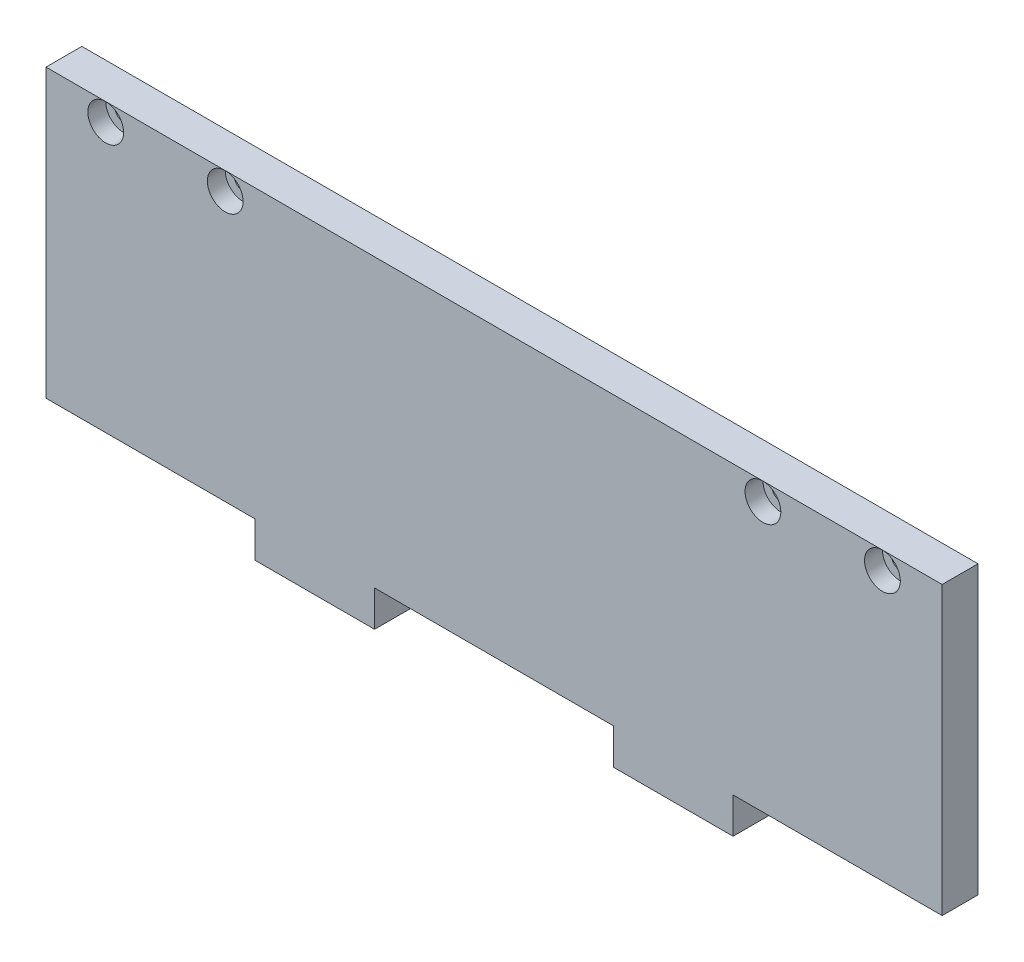
ISO-10303-21;
HEADER;
FILE_DESCRIPTION(('STEP AP214'),'2;1');
FILE_NAME('part.step','',(''),(''),'','','');
FILE_SCHEMA(('AUTOMOTIVE_DESIGN { 1 0 10303 214 1 1 1 1 }'));
ENDSEC;
DATA;
#1=APPLICATION_CONTEXT('core data for automotive mechanical design processes');
#2=APPLICATION_PROTOCOL_DEFINITION('international standard','automotive_design',2000,#1);
#3=PRODUCT_CONTEXT('',#1,'mechanical');
#4=PRODUCT('Part','Part','',(#3));
#5=PRODUCT_RELATED_PRODUCT_CATEGORY('part','',(#4));
#6=PRODUCT_DEFINITION_FORMATION('','',#4);
#7=PRODUCT_DEFINITION_CONTEXT('part definition',#1,'design');
#8=PRODUCT_DEFINITION('design','',#6,#7);
#9=PRODUCT_DEFINITION_SHAPE('','',#8);
#10=(LENGTH_UNIT() NAMED_UNIT(*) SI_UNIT(.MILLI.,.METRE.));
#11=(NAMED_UNIT(*) PLANE_ANGLE_UNIT() SI_UNIT($,.RADIAN.));
#12=(NAMED_UNIT(*) SI_UNIT($,.STERADIAN.) SOLID_ANGLE_UNIT());
#13=UNCERTAINTY_MEASURE_WITH_UNIT(LENGTH_MEASURE(1.E-05),#10,'distance_accuracy_value','');
#14=(GEOMETRIC_REPRESENTATION_CONTEXT(3) GLOBAL_UNCERTAINTY_ASSIGNED_CONTEXT((#13)) GLOBAL_UNIT_ASSIGNED_CONTEXT((#10,
#11,#12)) REPRESENTATION_CONTEXT('',''));
#15=CARTESIAN_POINT('',(0.,0.,0.));
#16=DIRECTION('',(0.,0.,1.));
#17=DIRECTION('',(1.,0.,0.));
#18=AXIS2_PLACEMENT_3D('',#15,#16,#17);
#19=CARTESIAN_POINT('',(-120.,51.0000000000001,0.));
#20=DIRECTION('',(0.,0.,1.));
#21=DIRECTION('',(1.,0.,0.));
#22=AXIS2_PLACEMENT_3D('',#19,#20,#21);
#23=CYLINDRICAL_SURFACE('',#22,1.5);
#24=CARTESIAN_POINT('',(-120.,51.0000000000001,0.));
#25=DIRECTION('',(0.,0.,1.));
#26=DIRECTION('',(1.,0.,0.));
#27=AXIS2_PLACEMENT_3D('',#24,#25,#26);
#28=CIRCLE('',#27,1.5);
#29=CARTESIAN_POINT('',(-118.5,51.0000000000001,0.));
#30=VERTEX_POINT('',#29);
#31=EDGE_CURVE('E196',#30,#30,#28,.T.);
#32=ORIENTED_EDGE('',*,*,#31,.F.);
#33=EDGE_LOOP('',(#32));
#34=FACE_BOUND('',#33,.T.);
#35=CARTESIAN_POINT('',(-120.,51.0000000000001,3.));
#36=DIRECTION('',(0.,0.,1.));
#37=DIRECTION('',(1.,0.,0.));
#38=AXIS2_PLACEMENT_3D('',#35,#36,#37);
#39=CIRCLE('',#38,1.5);
#40=CARTESIAN_POINT('',(-118.5,51.0000000000001,3.));
#41=VERTEX_POINT('',#40);
#42=EDGE_CURVE('E162',#41,#41,#39,.F.);
#43=ORIENTED_EDGE('',*,*,#42,.F.);
#44=EDGE_LOOP('',(#43));
#45=FACE_BOUND('',#44,.T.);
#46=ADVANCED_FACE('F33',(#34,#45),#23,.F.);
#47=CARTESIAN_POINT('',(-140.,51.0000000000001,0.));
#48=DIRECTION('',(0.,0.,1.));
#49=DIRECTION('',(1.,0.,0.));
#50=AXIS2_PLACEMENT_3D('',#47,#48,#49);
#51=CYLINDRICAL_SURFACE('',#50,1.5);
#52=CARTESIAN_POINT('',(-140.,51.0000000000001,0.));
#53=DIRECTION('',(0.,0.,1.));
#54=DIRECTION('',(1.,0.,0.));
#55=AXIS2_PLACEMENT_3D('',#52,#53,#54);
#56=CIRCLE('',#55,1.5);
#57=CARTESIAN_POINT('',(-138.5,51.0000000000001,0.));
#58=VERTEX_POINT('',#57);
#59=EDGE_CURVE('E199',#58,#58,#56,.T.);
#60=ORIENTED_EDGE('',*,*,#59,.F.);
#61=EDGE_LOOP('',(#60));
#62=FACE_BOUND('',#61,.T.);
#63=CARTESIAN_POINT('',(-140.,51.0000000000001,3.));
#64=DIRECTION('',(0.,0.,1.));
#65=DIRECTION('',(1.,0.,0.));
#66=AXIS2_PLACEMENT_3D('',#63,#64,#65);
#67=CIRCLE('',#66,1.5);
#68=CARTESIAN_POINT('',(-138.5,51.0000000000001,3.));
#69=VERTEX_POINT('',#68);
#70=EDGE_CURVE('E157',#69,#69,#67,.F.);
#71=ORIENTED_EDGE('',*,*,#70,.F.);
#72=EDGE_LOOP('',(#71));
#73=FACE_BOUND('',#72,.T.);
#74=ADVANCED_FACE('F309',(#62,#73),#51,.F.);
#75=CARTESIAN_POINT('',(0.,0.,6.));
#76=DIRECTION('',(0.,1.,0.));
#77=DIRECTION('',(-1.,0.,0.));
#78=AXIS2_PLACEMENT_3D('',#75,#76,#77);
#79=PLANE('',#78);
#80=DIRECTION('',(1.,0.,0.));
#81=VECTOR('',#80,1.);
#82=CARTESIAN_POINT('',(0.,0.,6.));
#83=LINE('',#82,#81);
#84=CARTESIAN_POINT('',(-115.,0.,6.));
#85=VERTEX_POINT('',#84);
#86=CARTESIAN_POINT('',(-95.,0.,6.));
#87=VERTEX_POINT('',#86);
#88=EDGE_CURVE('E140',#85,#87,#83,.T.);
#89=ORIENTED_EDGE('',*,*,#88,.F.);
#90=DIRECTION('',(0.,0.,1.));
#91=VECTOR('',#90,1.);
#92=CARTESIAN_POINT('',(-115.,0.,0.));
#93=LINE('',#92,#91);
#94=CARTESIAN_POINT('',(-115.,0.,0.));
#95=VERTEX_POINT('',#94);
#96=EDGE_CURVE('E127',#95,#85,#93,.T.);
#97=ORIENTED_EDGE('',*,*,#96,.F.);
#98=DIRECTION('',(1.,0.,0.));
#99=VECTOR('',#98,1.);
#100=CARTESIAN_POINT('',(0.,0.,0.));
#101=LINE('',#100,#99);
#102=CARTESIAN_POINT('',(-95.,0.,0.));
#103=VERTEX_POINT('',#102);
#104=EDGE_CURVE('E138',#95,#103,#101,.T.);
#105=ORIENTED_EDGE('',*,*,#104,.T.);
#106=DIRECTION('',(0.,0.,1.));
#107=VECTOR('',#106,1.);
#108=CARTESIAN_POINT('',(-95.,0.,0.));
#109=LINE('',#108,#107);
#110=EDGE_CURVE('E217',#103,#87,#109,.T.);
#111=ORIENTED_EDGE('',*,*,#110,.T.);
#112=EDGE_LOOP('',(#89,#97,#105,#111));
#113=FACE_BOUND('',#112,.T.);
#114=ADVANCED_FACE('F136',(#113),#79,.F.);
#115=CARTESIAN_POINT('',(0.,0.,6.));
#116=DIRECTION('',(-1.,0.,0.));
#117=DIRECTION('',(0.,-1.,0.));
#118=AXIS2_PLACEMENT_3D('',#115,#116,#117);
#119=PLANE('',#118);
#120=DIRECTION('',(0.,1.,0.));
#121=VECTOR('',#120,1.);
#122=CARTESIAN_POINT('',(0.,0.,6.));
#123=LINE('',#122,#121);
#124=CARTESIAN_POINT('',(0.,6.,6.));
#125=VERTEX_POINT('',#124);
#126=CARTESIAN_POINT('',(0.,54.0000000000001,6.));
#127=VERTEX_POINT('',#126);
#128=EDGE_CURVE('E146',#125,#127,#123,.T.);
#129=ORIENTED_EDGE('',*,*,#128,.F.);
#130=DIRECTION('',(0.,0.,1.));
#131=VECTOR('',#130,1.);
#132=CARTESIAN_POINT('',(0.,6.,0.));
#133=LINE('',#132,#131);
#134=CARTESIAN_POINT('',(0.,6.,0.));
#135=VERTEX_POINT('',#134);
#136=EDGE_CURVE('E240',#135,#125,#133,.T.);
#137=ORIENTED_EDGE('',*,*,#136,.F.);
#138=DIRECTION('',(0.,1.,0.));
#139=VECTOR('',#138,1.);
#140=CARTESIAN_POINT('',(0.,0.,0.));
#141=LINE('',#140,#139);
#142=CARTESIAN_POINT('',(0.,54.0000000000001,0.));
#143=VERTEX_POINT('',#142);
#144=EDGE_CURVE('E248',#135,#143,#141,.T.);
#145=ORIENTED_EDGE('',*,*,#144,.T.);
#146=DIRECTION('',(0.,0.,-1.));
#147=VECTOR('',#146,1.);
#148=CARTESIAN_POINT('',(0.,54.0000000000001,6.));
#149=LINE('',#148,#147);
#150=EDGE_CURVE('E11',#127,#143,#149,.T.);
#151=ORIENTED_EDGE('',*,*,#150,.F.);
#152=EDGE_LOOP('',(#129,#137,#145,#151));
#153=FACE_BOUND('',#152,.T.);
#154=ADVANCED_FACE('F35',(#153),#119,.F.);
#155=CARTESIAN_POINT('',(0.,54.0000000000001,6.));
#156=DIRECTION('',(0.,-1.,0.));
#157=DIRECTION('',(1.,0.,0.));
#158=AXIS2_PLACEMENT_3D('',#155,#156,#157);
#159=PLANE('',#158);
#160=DIRECTION('',(-1.,0.,0.));
#161=VECTOR('',#160,1.);
#162=CARTESIAN_POINT('',(0.,54.0000000000001,0.));
#163=LINE('',#162,#161);
#164=CARTESIAN_POINT('',(-150.,54.,0.));
#165=VERTEX_POINT('',#164);
#166=EDGE_CURVE('E258',#143,#165,#163,.T.);
#167=ORIENTED_EDGE('',*,*,#166,.T.);
#168=DIRECTION('',(0.,0.,-1.));
#169=VECTOR('',#168,1.);
#170=CARTESIAN_POINT('',(-150.,54.,6.));
#171=LINE('',#170,#169);
#172=CARTESIAN_POINT('',(-150.,54.,6.));
#173=VERTEX_POINT('',#172);
#174=EDGE_CURVE('E42',#173,#165,#171,.T.);
#175=ORIENTED_EDGE('',*,*,#174,.F.);
#176=DIRECTION('',(-1.,0.,0.));
#177=VECTOR('',#176,1.);
#178=CARTESIAN_POINT('',(0.,54.0000000000001,6.));
#179=LINE('',#178,#177);
#180=EDGE_CURVE('E149',#127,#173,#179,.T.);
#181=ORIENTED_EDGE('',*,*,#180,.F.);
#182=ORIENTED_EDGE('',*,*,#150,.T.);
#183=EDGE_LOOP('',(#167,#175,#181,#182));
#184=FACE_BOUND('',#183,.T.);
#185=ADVANCED_FACE('F270',(#184),#159,.F.);
#186=CARTESIAN_POINT('',(-150.,0.,6.));
#187=DIRECTION('',(1.,0.,0.));
#188=DIRECTION('',(0.,0.,-1.));
#189=AXIS2_PLACEMENT_3D('',#186,#187,#188);
#190=PLANE('',#189);
#191=DIRECTION('',(0.,-1.,0.));
#192=VECTOR('',#191,1.);
#193=CARTESIAN_POINT('',(-150.,0.,0.));
#194=LINE('',#193,#192);
#195=CARTESIAN_POINT('',(-150.,6.,0.));
#196=VERTEX_POINT('',#195);
#197=EDGE_CURVE('E151',#165,#196,#194,.T.);
#198=ORIENTED_EDGE('',*,*,#197,.T.);
#199=DIRECTION('',(0.,0.,1.));
#200=VECTOR('',#199,1.);
#201=CARTESIAN_POINT('',(-150.,6.,0.));
#202=LINE('',#201,#200);
#203=CARTESIAN_POINT('',(-150.,6.,6.));
#204=VERTEX_POINT('',#203);
#205=EDGE_CURVE('E206',#196,#204,#202,.T.);
#206=ORIENTED_EDGE('',*,*,#205,.T.);
#207=DIRECTION('',(0.,-1.,0.));
#208=VECTOR('',#207,1.);
#209=CARTESIAN_POINT('',(-150.,0.,6.));
#210=LINE('',#209,#208);
#211=EDGE_CURVE('E253',#173,#204,#210,.T.);
#212=ORIENTED_EDGE('',*,*,#211,.F.);
#213=ORIENTED_EDGE('',*,*,#174,.T.);
#214=EDGE_LOOP('',(#198,#206,#212,#213));
#215=FACE_BOUND('',#214,.T.);
#216=ADVANCED_FACE('F265',(#215),#190,.F.);
#217=CARTESIAN_POINT('',(-55.,0.,6.));
#218=VERTEX_POINT('',#217);
#219=CARTESIAN_POINT('',(-35.,0.,6.));
#220=VERTEX_POINT('',#219);
#221=EDGE_CURVE('E256',#218,#220,#83,.T.);
#222=ORIENTED_EDGE('',*,*,#221,.F.);
#223=DIRECTION('',(0.,0.,1.));
#224=VECTOR('',#223,1.);
#225=CARTESIAN_POINT('',(-55.,0.,0.));
#226=LINE('',#225,#224);
#227=CARTESIAN_POINT('',(-55.,0.,0.));
#228=VERTEX_POINT('',#227);
#229=EDGE_CURVE('E230',#228,#218,#226,.T.);
#230=ORIENTED_EDGE('',*,*,#229,.F.);
#231=CARTESIAN_POINT('',(-35.,0.,0.));
#232=VERTEX_POINT('',#231);
#233=EDGE_CURVE('E147',#228,#232,#101,.T.);
#234=ORIENTED_EDGE('',*,*,#233,.T.);
#235=DIRECTION('',(0.,0.,1.));
#236=VECTOR('',#235,1.);
#237=CARTESIAN_POINT('',(-35.,0.,0.));
#238=LINE('',#237,#236);
#239=EDGE_CURVE('E245',#232,#220,#238,.T.);
#240=ORIENTED_EDGE('',*,*,#239,.T.);
#241=EDGE_LOOP('',(#222,#230,#234,#240));
#242=FACE_BOUND('',#241,.T.);
#243=ADVANCED_FACE('F288',(#242),#79,.F.);
#244=CARTESIAN_POINT('',(0.,0.,6.));
#245=DIRECTION('',(0.,0.,1.));
#246=DIRECTION('',(1.,0.,0.));
#247=AXIS2_PLACEMENT_3D('',#244,#245,#246);
#248=PLANE('',#247);
#249=CARTESIAN_POINT('',(-10.,51.0000000000001,6.));
#250=DIRECTION('',(0.,0.,1.));
#251=DIRECTION('',(-1.,0.,0.));
#252=AXIS2_PLACEMENT_3D('',#249,#250,#251);
#253=CIRCLE('',#252,2.995);
#254=CARTESIAN_POINT('',(-12.995,51.0000000000001,6.));
#255=VERTEX_POINT('',#254);
#256=EDGE_CURVE('E182',#255,#255,#253,.T.);
#257=ORIENTED_EDGE('',*,*,#256,.F.);
#258=EDGE_LOOP('',(#257));
#259=FACE_BOUND('',#258,.T.);
#260=CARTESIAN_POINT('',(-30.,51.0000000000001,6.));
#261=DIRECTION('',(0.,0.,1.));
#262=DIRECTION('',(-1.,0.,0.));
#263=AXIS2_PLACEMENT_3D('',#260,#261,#262);
#264=CIRCLE('',#263,2.995);
#265=CARTESIAN_POINT('',(-32.995,51.0000000000001,6.));
#266=VERTEX_POINT('',#265);
#267=EDGE_CURVE('E175',#266,#266,#264,.T.);
#268=ORIENTED_EDGE('',*,*,#267,.F.);
#269=EDGE_LOOP('',(#268));
#270=FACE_BOUND('',#269,.T.);
#271=CARTESIAN_POINT('',(-120.,51.0000000000001,6.));
#272=DIRECTION('',(0.,0.,1.));
#273=DIRECTION('',(1.,0.,0.));
#274=AXIS2_PLACEMENT_3D('',#271,#272,#273);
#275=CIRCLE('',#274,2.995);
#276=CARTESIAN_POINT('',(-117.005,51.0000000000001,6.));
#277=VERTEX_POINT('',#276);
#278=EDGE_CURVE('E168',#277,#277,#275,.T.);
#279=ORIENTED_EDGE('',*,*,#278,.F.);
#280=EDGE_LOOP('',(#279));
#281=FACE_BOUND('',#280,.T.);
#282=CARTESIAN_POINT('',(-140.,51.0000000000001,6.));
#283=DIRECTION('',(0.,0.,1.));
#284=DIRECTION('',(1.,0.,0.));
#285=AXIS2_PLACEMENT_3D('',#282,#283,#284);
#286=CIRCLE('',#285,2.995);
#287=CARTESIAN_POINT('',(-137.005,51.0000000000001,6.));
#288=VERTEX_POINT('',#287);
#289=EDGE_CURVE('E164',#288,#288,#286,.T.);
#290=ORIENTED_EDGE('',*,*,#289,.F.);
#291=EDGE_LOOP('',(#290));
#292=FACE_BOUND('',#291,.T.);
#293=DIRECTION('',(-1.,0.,0.));
#294=VECTOR('',#293,1.);
#295=CARTESIAN_POINT('',(-150.,6.,6.));
#296=LINE('',#295,#294);
#297=CARTESIAN_POINT('',(-115.,6.,6.));
#298=VERTEX_POINT('',#297);
#299=EDGE_CURVE('E132',#298,#204,#296,.T.);
#300=ORIENTED_EDGE('',*,*,#299,.F.);
#301=DIRECTION('',(0.,1.,0.));
#302=VECTOR('',#301,1.);
#303=CARTESIAN_POINT('',(-115.,0.,6.));
#304=LINE('',#303,#302);
#305=EDGE_CURVE('E201',#85,#298,#304,.T.);
#306=ORIENTED_EDGE('',*,*,#305,.F.);
#307=ORIENTED_EDGE('',*,*,#88,.T.);
#308=DIRECTION('',(0.,-1.,0.));
#309=VECTOR('',#308,1.);
#310=CARTESIAN_POINT('',(-95.,0.,6.));
#311=LINE('',#310,#309);
#312=CARTESIAN_POINT('',(-95.,5.99999999999996,6.));
#313=VERTEX_POINT('',#312);
#314=EDGE_CURVE('E209',#313,#87,#311,.T.);
#315=ORIENTED_EDGE('',*,*,#314,.F.);
#316=DIRECTION('',(-1.,0.,0.));
#317=VECTOR('',#316,1.);
#318=CARTESIAN_POINT('',(-95.,5.99999999999996,6.));
#319=LINE('',#318,#317);
#320=CARTESIAN_POINT('',(-55.,5.99999999999996,6.));
#321=VERTEX_POINT('',#320);
#322=EDGE_CURVE('E213',#321,#313,#319,.T.);
#323=ORIENTED_EDGE('',*,*,#322,.F.);
#324=DIRECTION('',(0.,1.,0.));
#325=VECTOR('',#324,1.);
#326=CARTESIAN_POINT('',(-55.,0.,6.));
#327=LINE('',#326,#325);
#328=EDGE_CURVE('E220',#218,#321,#327,.T.);
#329=ORIENTED_EDGE('',*,*,#328,.F.);
#330=ORIENTED_EDGE('',*,*,#221,.T.);
#331=DIRECTION('',(0.,-1.,0.));
#332=VECTOR('',#331,1.);
#333=CARTESIAN_POINT('',(-35.,0.,6.));
#334=LINE('',#333,#332);
#335=CARTESIAN_POINT('',(-35.,5.99999999999999,6.));
#336=VERTEX_POINT('',#335);
#337=EDGE_CURVE('E237',#336,#220,#334,.T.);
#338=ORIENTED_EDGE('',*,*,#337,.F.);
#339=DIRECTION('',(-1.,0.,0.));
#340=VECTOR('',#339,1.);
#341=CARTESIAN_POINT('',(0.,6.,6.));
#342=LINE('',#341,#340);
#343=EDGE_CURVE('E227',#125,#336,#342,.T.);
#344=ORIENTED_EDGE('',*,*,#343,.F.);
#345=ORIENTED_EDGE('',*,*,#128,.T.);
#346=ORIENTED_EDGE('',*,*,#180,.T.);
#347=ORIENTED_EDGE('',*,*,#211,.T.);
#348=EDGE_LOOP('',(#300,#306,#307,#315,#323,#329,#330,#338,#344,#345,#346,#347));
#349=FACE_BOUND('',#348,.T.);
#350=ADVANCED_FACE('F281',(#259,#270,#281,#292,#349),#248,.T.);
#351=CARTESIAN_POINT('',(0.,0.,0.));
#352=DIRECTION('',(0.,0.,1.));
#353=DIRECTION('',(1.,0.,0.));
#354=AXIS2_PLACEMENT_3D('',#351,#352,#353);
#355=PLANE('',#354);
#356=CARTESIAN_POINT('',(-10.,51.0000000000001,0.));
#357=DIRECTION('',(0.,0.,1.));
#358=DIRECTION('',(-1.,0.,0.));
#359=AXIS2_PLACEMENT_3D('',#356,#357,#358);
#360=CIRCLE('',#359,1.5);
#361=CARTESIAN_POINT('',(-11.5,51.0000000000001,0.));
#362=VERTEX_POINT('',#361);
#363=EDGE_CURVE('E160',#362,#362,#360,.T.);
#364=ORIENTED_EDGE('',*,*,#363,.T.);
#365=EDGE_LOOP('',(#364));
#366=FACE_BOUND('',#365,.T.);
#367=CARTESIAN_POINT('',(-30.,51.0000000000001,0.));
#368=DIRECTION('',(0.,0.,1.));
#369=DIRECTION('',(-1.,0.,0.));
#370=AXIS2_PLACEMENT_3D('',#367,#368,#369);
#371=CIRCLE('',#370,1.5);
#372=CARTESIAN_POINT('',(-31.5,51.0000000000001,0.));
#373=VERTEX_POINT('',#372);
#374=EDGE_CURVE('E193',#373,#373,#371,.T.);
#375=ORIENTED_EDGE('',*,*,#374,.T.);
#376=EDGE_LOOP('',(#375));
#377=FACE_BOUND('',#376,.T.);
#378=ORIENTED_EDGE('',*,*,#31,.T.);
#379=EDGE_LOOP('',(#378));
#380=FACE_BOUND('',#379,.T.);
#381=ORIENTED_EDGE('',*,*,#59,.T.);
#382=EDGE_LOOP('',(#381));
#383=FACE_BOUND('',#382,.T.);
#384=DIRECTION('',(0.,1.,0.));
#385=VECTOR('',#384,1.);
#386=CARTESIAN_POINT('',(-115.,0.,0.));
#387=LINE('',#386,#385);
#388=CARTESIAN_POINT('',(-115.,6.,0.));
#389=VERTEX_POINT('',#388);
#390=EDGE_CURVE('E123',#95,#389,#387,.T.);
#391=ORIENTED_EDGE('',*,*,#390,.T.);
#392=DIRECTION('',(-1.,0.,0.));
#393=VECTOR('',#392,1.);
#394=CARTESIAN_POINT('',(-150.,6.,0.));
#395=LINE('',#394,#393);
#396=EDGE_CURVE('E50',#389,#196,#395,.T.);
#397=ORIENTED_EDGE('',*,*,#396,.T.);
#398=ORIENTED_EDGE('',*,*,#197,.F.);
#399=ORIENTED_EDGE('',*,*,#166,.F.);
#400=ORIENTED_EDGE('',*,*,#144,.F.);
#401=DIRECTION('',(-1.,0.,0.));
#402=VECTOR('',#401,1.);
#403=CARTESIAN_POINT('',(0.,6.,0.));
#404=LINE('',#403,#402);
#405=CARTESIAN_POINT('',(-35.,5.99999999999999,0.));
#406=VERTEX_POINT('',#405);
#407=EDGE_CURVE('E233',#135,#406,#404,.T.);
#408=ORIENTED_EDGE('',*,*,#407,.T.);
#409=DIRECTION('',(0.,-1.,0.));
#410=VECTOR('',#409,1.);
#411=CARTESIAN_POINT('',(-35.,0.,0.));
#412=LINE('',#411,#410);
#413=EDGE_CURVE('E236',#406,#232,#412,.T.);
#414=ORIENTED_EDGE('',*,*,#413,.T.);
#415=ORIENTED_EDGE('',*,*,#233,.F.);
#416=DIRECTION('',(0.,1.,0.));
#417=VECTOR('',#416,1.);
#418=CARTESIAN_POINT('',(-55.,0.,0.));
#419=LINE('',#418,#417);
#420=CARTESIAN_POINT('',(-55.,5.99999999999996,0.));
#421=VERTEX_POINT('',#420);
#422=EDGE_CURVE('E212',#228,#421,#419,.T.);
#423=ORIENTED_EDGE('',*,*,#422,.T.);
#424=DIRECTION('',(-1.,0.,0.));
#425=VECTOR('',#424,1.);
#426=CARTESIAN_POINT('',(-95.,5.99999999999996,0.));
#427=LINE('',#426,#425);
#428=CARTESIAN_POINT('',(-95.,5.99999999999996,0.));
#429=VERTEX_POINT('',#428);
#430=EDGE_CURVE('E58',#421,#429,#427,.T.);
#431=ORIENTED_EDGE('',*,*,#430,.T.);
#432=DIRECTION('',(0.,-1.,0.));
#433=VECTOR('',#432,1.);
#434=CARTESIAN_POINT('',(-95.,0.,0.));
#435=LINE('',#434,#433);
#436=EDGE_CURVE('E145',#429,#103,#435,.T.);
#437=ORIENTED_EDGE('',*,*,#436,.T.);
#438=ORIENTED_EDGE('',*,*,#104,.F.);
#439=EDGE_LOOP('',(#391,#397,#398,#399,#400,#408,#414,#415,#423,#431,#437,#438));
#440=FACE_BOUND('',#439,.T.);
#441=ADVANCED_FACE('F143',(#366,#377,#380,#383,#440),#355,.F.);
#442=CARTESIAN_POINT('',(-35.,0.,0.));
#443=DIRECTION('',(-1.,0.,0.));
#444=DIRECTION('',(0.,0.,1.));
#445=AXIS2_PLACEMENT_3D('',#442,#443,#444);
#446=PLANE('',#445);
#447=ORIENTED_EDGE('',*,*,#337,.T.);
#448=ORIENTED_EDGE('',*,*,#239,.F.);
#449=ORIENTED_EDGE('',*,*,#413,.F.);
#450=DIRECTION('',(0.,0.,1.));
#451=VECTOR('',#450,1.);
#452=CARTESIAN_POINT('',(-35.,5.99999999999999,0.));
#453=LINE('',#452,#451);
#454=EDGE_CURVE('E249',#406,#336,#453,.T.);
#455=ORIENTED_EDGE('',*,*,#454,.T.);
#456=EDGE_LOOP('',(#447,#448,#449,#455));
#457=FACE_BOUND('',#456,.T.);
#458=ADVANCED_FACE('F286',(#457),#446,.F.);
#459=CARTESIAN_POINT('',(0.,6.,0.));
#460=DIRECTION('',(0.,1.,0.));
#461=DIRECTION('',(-1.,0.,0.));
#462=AXIS2_PLACEMENT_3D('',#459,#460,#461);
#463=PLANE('',#462);
#464=ORIENTED_EDGE('',*,*,#343,.T.);
#465=ORIENTED_EDGE('',*,*,#454,.F.);
#466=ORIENTED_EDGE('',*,*,#407,.F.);
#467=ORIENTED_EDGE('',*,*,#136,.T.);
#468=EDGE_LOOP('',(#464,#465,#466,#467));
#469=FACE_BOUND('',#468,.T.);
#470=ADVANCED_FACE('F276',(#469),#463,.F.);
#471=CARTESIAN_POINT('',(-95.,0.,0.));
#472=DIRECTION('',(-1.,0.,0.));
#473=DIRECTION('',(0.,0.,1.));
#474=AXIS2_PLACEMENT_3D('',#471,#472,#473);
#475=PLANE('',#474);
#476=ORIENTED_EDGE('',*,*,#314,.T.);
#477=ORIENTED_EDGE('',*,*,#110,.F.);
#478=ORIENTED_EDGE('',*,*,#436,.F.);
#479=DIRECTION('',(0.,0.,1.));
#480=VECTOR('',#479,1.);
#481=CARTESIAN_POINT('',(-95.,5.99999999999996,0.));
#482=LINE('',#481,#480);
#483=EDGE_CURVE('E225',#429,#313,#482,.T.);
#484=ORIENTED_EDGE('',*,*,#483,.T.);
#485=EDGE_LOOP('',(#476,#477,#478,#484));
#486=FACE_BOUND('',#485,.T.);
#487=ADVANCED_FACE('F297',(#486),#475,.F.);
#488=CARTESIAN_POINT('',(-95.,5.99999999999996,0.));
#489=DIRECTION('',(0.,1.,0.));
#490=DIRECTION('',(0.,0.,1.));
#491=AXIS2_PLACEMENT_3D('',#488,#489,#490);
#492=PLANE('',#491);
#493=ORIENTED_EDGE('',*,*,#322,.T.);
#494=ORIENTED_EDGE('',*,*,#483,.F.);
#495=ORIENTED_EDGE('',*,*,#430,.F.);
#496=DIRECTION('',(0.,0.,1.));
#497=VECTOR('',#496,1.);
#498=CARTESIAN_POINT('',(-55.,5.99999999999996,0.));
#499=LINE('',#498,#497);
#500=EDGE_CURVE('E228',#421,#321,#499,.T.);
#501=ORIENTED_EDGE('',*,*,#500,.T.);
#502=EDGE_LOOP('',(#493,#494,#495,#501));
#503=FACE_BOUND('',#502,.T.);
#504=ADVANCED_FACE('F294',(#503),#492,.F.);
#505=CARTESIAN_POINT('',(-55.,0.,0.));
#506=DIRECTION('',(1.,0.,0.));
#507=DIRECTION('',(0.,0.,-1.));
#508=AXIS2_PLACEMENT_3D('',#505,#506,#507);
#509=PLANE('',#508);
#510=ORIENTED_EDGE('',*,*,#328,.T.);
#511=ORIENTED_EDGE('',*,*,#500,.F.);
#512=ORIENTED_EDGE('',*,*,#422,.F.);
#513=ORIENTED_EDGE('',*,*,#229,.T.);
#514=EDGE_LOOP('',(#510,#511,#512,#513));
#515=FACE_BOUND('',#514,.T.);
#516=ADVANCED_FACE('F292',(#515),#509,.F.);
#517=CARTESIAN_POINT('',(-150.,6.,0.));
#518=DIRECTION('',(0.,1.,0.));
#519=DIRECTION('',(0.,0.,1.));
#520=AXIS2_PLACEMENT_3D('',#517,#518,#519);
#521=PLANE('',#520);
#522=ORIENTED_EDGE('',*,*,#299,.T.);
#523=ORIENTED_EDGE('',*,*,#205,.F.);
#524=ORIENTED_EDGE('',*,*,#396,.F.);
#525=DIRECTION('',(0.,0.,1.));
#526=VECTOR('',#525,1.);
#527=CARTESIAN_POINT('',(-115.,6.,0.));
#528=LINE('',#527,#526);
#529=EDGE_CURVE('E129',#389,#298,#528,.T.);
#530=ORIENTED_EDGE('',*,*,#529,.T.);
#531=EDGE_LOOP('',(#522,#523,#524,#530));
#532=FACE_BOUND('',#531,.T.);
#533=ADVANCED_FACE('F324',(#532),#521,.F.);
#534=CARTESIAN_POINT('',(-115.,0.,0.));
#535=DIRECTION('',(1.,0.,0.));
#536=DIRECTION('',(0.,0.,-1.));
#537=AXIS2_PLACEMENT_3D('',#534,#535,#536);
#538=PLANE('',#537);
#539=ORIENTED_EDGE('',*,*,#305,.T.);
#540=ORIENTED_EDGE('',*,*,#529,.F.);
#541=ORIENTED_EDGE('',*,*,#390,.F.);
#542=ORIENTED_EDGE('',*,*,#96,.T.);
#543=EDGE_LOOP('',(#539,#540,#541,#542));
#544=FACE_BOUND('',#543,.T.);
#545=ADVANCED_FACE('F126',(#544),#538,.F.);
#546=CARTESIAN_POINT('',(-30.,51.0000000000001,0.));
#547=DIRECTION('',(0.,0.,1.));
#548=DIRECTION('',(1.,0.,0.));
#549=AXIS2_PLACEMENT_3D('',#546,#547,#548);
#550=CYLINDRICAL_SURFACE('',#549,1.5);
#551=CARTESIAN_POINT('',(-30.,51.0000000000001,3.));
#552=DIRECTION('',(0.,0.,-1.));
#553=DIRECTION('',(-1.,0.,0.));
#554=AXIS2_PLACEMENT_3D('',#551,#552,#553);
#555=CIRCLE('',#554,1.5);
#556=CARTESIAN_POINT('',(-31.5,51.0000000000001,3.));
#557=VERTEX_POINT('',#556);
#558=EDGE_CURVE('E166',#557,#557,#555,.F.);
#559=ORIENTED_EDGE('',*,*,#558,.T.);
#560=EDGE_LOOP('',(#559));
#561=FACE_BOUND('',#560,.T.);
#562=ORIENTED_EDGE('',*,*,#374,.F.);
#563=EDGE_LOOP('',(#562));
#564=FACE_BOUND('',#563,.T.);
#565=ADVANCED_FACE('F321',(#561,#564),#550,.F.);
#566=CARTESIAN_POINT('',(-10.,51.0000000000001,0.));
#567=DIRECTION('',(0.,0.,1.));
#568=DIRECTION('',(1.,0.,0.));
#569=AXIS2_PLACEMENT_3D('',#566,#567,#568);
#570=CYLINDRICAL_SURFACE('',#569,1.5);
#571=CARTESIAN_POINT('',(-10.,51.0000000000001,3.));
#572=DIRECTION('',(0.,0.,-1.));
#573=DIRECTION('',(-1.,0.,0.));
#574=AXIS2_PLACEMENT_3D('',#571,#572,#573);
#575=CIRCLE('',#574,1.5);
#576=CARTESIAN_POINT('',(-11.5,51.0000000000001,3.));
#577=VERTEX_POINT('',#576);
#578=EDGE_CURVE('E37',#577,#577,#575,.F.);
#579=ORIENTED_EDGE('',*,*,#578,.T.);
#580=EDGE_LOOP('',(#579));
#581=FACE_BOUND('',#580,.T.);
#582=ORIENTED_EDGE('',*,*,#363,.F.);
#583=EDGE_LOOP('',(#582));
#584=FACE_BOUND('',#583,.T.);
#585=ADVANCED_FACE('F348',(#581,#584),#570,.F.);
#586=CARTESIAN_POINT('',(-140.,51.0000000000001,3.));
#587=DIRECTION('',(0.,0.,1.));
#588=DIRECTION('',(1.,0.,0.));
#589=AXIS2_PLACEMENT_3D('',#586,#587,#588);
#590=PLANE('',#589);
#591=CARTESIAN_POINT('',(-140.,51.0000000000001,3.));
#592=DIRECTION('',(0.,0.,1.));
#593=DIRECTION('',(1.,0.,0.));
#594=AXIS2_PLACEMENT_3D('',#591,#592,#593);
#595=CIRCLE('',#594,2.995);
#596=CARTESIAN_POINT('',(-137.005,51.0000000000001,3.));
#597=VERTEX_POINT('',#596);
#598=EDGE_CURVE('E161',#597,#597,#595,.T.);
#599=ORIENTED_EDGE('',*,*,#598,.T.);
#600=EDGE_LOOP('',(#599));
#601=FACE_BOUND('',#600,.T.);
#602=ORIENTED_EDGE('',*,*,#70,.T.);
#603=EDGE_LOOP('',(#602));
#604=FACE_BOUND('',#603,.T.);
#605=ADVANCED_FACE('F357',(#601,#604),#590,.T.);
#606=CARTESIAN_POINT('',(-140.,51.0000000000001,3.));
#607=DIRECTION('',(0.,0.,1.));
#608=DIRECTION('',(1.,0.,0.));
#609=AXIS2_PLACEMENT_3D('',#606,#607,#608);
#610=CYLINDRICAL_SURFACE('',#609,2.995);
#611=ORIENTED_EDGE('',*,*,#598,.F.);
#612=EDGE_LOOP('',(#611));
#613=FACE_BOUND('',#612,.T.);
#614=ORIENTED_EDGE('',*,*,#289,.T.);
#615=EDGE_LOOP('',(#614));
#616=FACE_BOUND('',#615,.T.);
#617=ADVANCED_FACE('F375',(#613,#616),#610,.F.);
#618=CARTESIAN_POINT('',(-120.,51.0000000000001,3.));
#619=DIRECTION('',(0.,0.,1.));
#620=DIRECTION('',(1.,0.,0.));
#621=AXIS2_PLACEMENT_3D('',#618,#619,#620);
#622=PLANE('',#621);
#623=CARTESIAN_POINT('',(-120.,51.0000000000001,3.));
#624=DIRECTION('',(0.,0.,1.));
#625=DIRECTION('',(1.,0.,0.));
#626=AXIS2_PLACEMENT_3D('',#623,#624,#625);
#627=CIRCLE('',#626,2.995);
#628=CARTESIAN_POINT('',(-117.005,51.0000000000001,3.));
#629=VERTEX_POINT('',#628);
#630=EDGE_CURVE('E165',#629,#629,#627,.T.);
#631=ORIENTED_EDGE('',*,*,#630,.T.);
#632=EDGE_LOOP('',(#631));
#633=FACE_BOUND('',#632,.T.);
#634=ORIENTED_EDGE('',*,*,#42,.T.);
#635=EDGE_LOOP('',(#634));
#636=FACE_BOUND('',#635,.T.);
#637=ADVANCED_FACE('F382',(#633,#636),#622,.T.);
#638=CARTESIAN_POINT('',(-120.,51.0000000000001,3.));
#639=DIRECTION('',(0.,0.,1.));
#640=DIRECTION('',(1.,0.,0.));
#641=AXIS2_PLACEMENT_3D('',#638,#639,#640);
#642=CYLINDRICAL_SURFACE('',#641,2.995);
#643=ORIENTED_EDGE('',*,*,#630,.F.);
#644=EDGE_LOOP('',(#643));
#645=FACE_BOUND('',#644,.T.);
#646=ORIENTED_EDGE('',*,*,#278,.T.);
#647=EDGE_LOOP('',(#646));
#648=FACE_BOUND('',#647,.T.);
#649=ADVANCED_FACE('F390',(#645,#648),#642,.F.);
#650=CARTESIAN_POINT('',(-30.,51.0000000000001,3.));
#651=DIRECTION('',(0.,0.,-1.));
#652=DIRECTION('',(-1.,0.,0.));
#653=AXIS2_PLACEMENT_3D('',#650,#651,#652);
#654=PLANE('',#653);
#655=CARTESIAN_POINT('',(-30.,51.0000000000001,3.));
#656=DIRECTION('',(0.,0.,1.));
#657=DIRECTION('',(-1.,0.,0.));
#658=AXIS2_PLACEMENT_3D('',#655,#656,#657);
#659=CIRCLE('',#658,2.995);
#660=CARTESIAN_POINT('',(-32.995,51.0000000000001,3.));
#661=VERTEX_POINT('',#660);
#662=EDGE_CURVE('E169',#661,#661,#659,.T.);
#663=ORIENTED_EDGE('',*,*,#662,.T.);
#664=EDGE_LOOP('',(#663));
#665=FACE_BOUND('',#664,.T.);
#666=ORIENTED_EDGE('',*,*,#558,.F.);
#667=EDGE_LOOP('',(#666));
#668=FACE_BOUND('',#667,.T.);
#669=ADVANCED_FACE('F398',(#665,#668),#654,.F.);
#670=CARTESIAN_POINT('',(-30.,51.0000000000001,3.));
#671=DIRECTION('',(0.,0.,1.));
#672=DIRECTION('',(1.,0.,0.));
#673=AXIS2_PLACEMENT_3D('',#670,#671,#672);
#674=CYLINDRICAL_SURFACE('',#673,2.995);
#675=ORIENTED_EDGE('',*,*,#662,.F.);
#676=EDGE_LOOP('',(#675));
#677=FACE_BOUND('',#676,.T.);
#678=ORIENTED_EDGE('',*,*,#267,.T.);
#679=EDGE_LOOP('',(#678));
#680=FACE_BOUND('',#679,.T.);
#681=ADVANCED_FACE('F406',(#677,#680),#674,.F.);
#682=CARTESIAN_POINT('',(-10.,51.0000000000001,3.));
#683=DIRECTION('',(0.,0.,-1.));
#684=DIRECTION('',(-1.,0.,0.));
#685=AXIS2_PLACEMENT_3D('',#682,#683,#684);
#686=PLANE('',#685);
#687=CARTESIAN_POINT('',(-10.,51.0000000000001,3.));
#688=DIRECTION('',(0.,0.,1.));
#689=DIRECTION('',(-1.,0.,0.));
#690=AXIS2_PLACEMENT_3D('',#687,#688,#689);
#691=CIRCLE('',#690,2.995);
#692=CARTESIAN_POINT('',(-12.995,51.0000000000001,3.));
#693=VERTEX_POINT('',#692);
#694=EDGE_CURVE('E451',#693,#693,#691,.T.);
#695=ORIENTED_EDGE('',*,*,#694,.T.);
#696=EDGE_LOOP('',(#695));
#697=FACE_BOUND('',#696,.T.);
#698=ORIENTED_EDGE('',*,*,#578,.F.);
#699=EDGE_LOOP('',(#698));
#700=FACE_BOUND('',#699,.T.);
#701=ADVANCED_FACE('F413',(#697,#700),#686,.F.);
#702=CARTESIAN_POINT('',(-10.,51.0000000000001,3.));
#703=DIRECTION('',(0.,0.,1.));
#704=DIRECTION('',(1.,0.,0.));
#705=AXIS2_PLACEMENT_3D('',#702,#703,#704);
#706=CYLINDRICAL_SURFACE('',#705,2.995);
#707=ORIENTED_EDGE('',*,*,#694,.F.);
#708=EDGE_LOOP('',(#707));
#709=FACE_BOUND('',#708,.T.);
#710=ORIENTED_EDGE('',*,*,#256,.T.);
#711=EDGE_LOOP('',(#710));
#712=FACE_BOUND('',#711,.T.);
#713=ADVANCED_FACE('F421',(#709,#712),#706,.F.);
#714=CLOSED_SHELL('',(#46,#74,#114,#154,#185,#216,#243,#350,#441,#458,#470,#487,#504,#516,#533,
#545,#565,#585,#605,#617,#637,#649,#669,#681,#701,#713));
#715=MANIFOLD_SOLID_BREP('B2',#714);
#716=ADVANCED_BREP_SHAPE_REPRESENTATION('',(#18,#715),#14);
#717=SHAPE_DEFINITION_REPRESENTATION(#9,#716);
ENDSEC;
END-ISO-10303-21;
